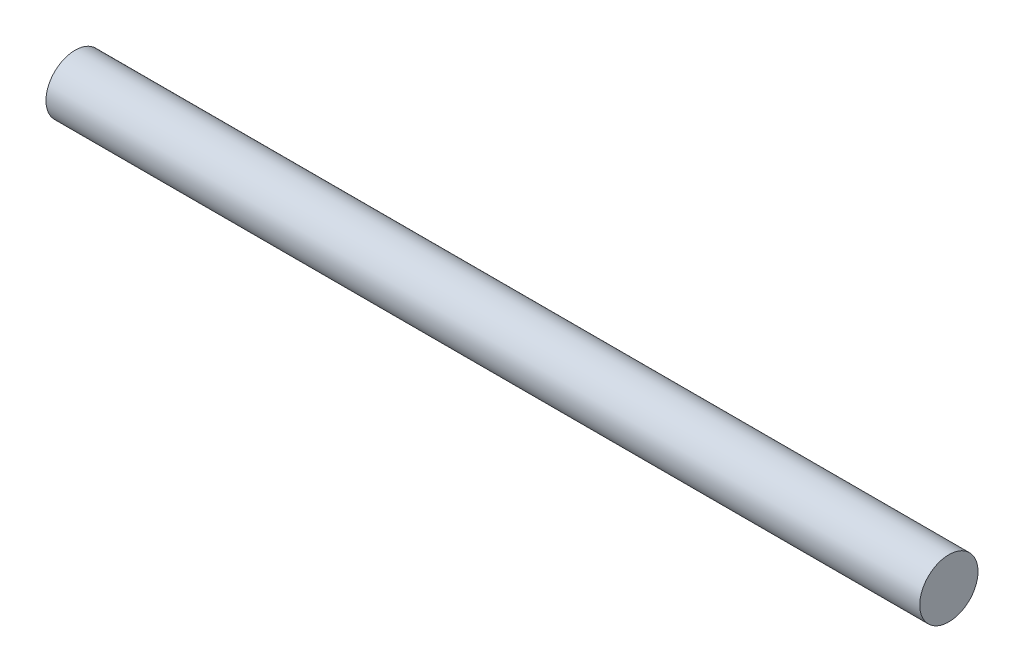
ISO-10303-21;
HEADER;
FILE_DESCRIPTION(('STEP AP214'),'2;1');
FILE_NAME('part.step','',(''),(''),'','','');
FILE_SCHEMA(('AUTOMOTIVE_DESIGN { 1 0 10303 214 1 1 1 1 }'));
ENDSEC;
DATA;
#1=APPLICATION_CONTEXT('core data for automotive mechanical design processes');
#2=APPLICATION_PROTOCOL_DEFINITION('international standard','automotive_design',2000,#1);
#3=PRODUCT_CONTEXT('',#1,'mechanical');
#4=PRODUCT('Part','Part','',(#3));
#5=PRODUCT_RELATED_PRODUCT_CATEGORY('part','',(#4));
#6=PRODUCT_DEFINITION_FORMATION('','',#4);
#7=PRODUCT_DEFINITION_CONTEXT('part definition',#1,'design');
#8=PRODUCT_DEFINITION('design','',#6,#7);
#9=PRODUCT_DEFINITION_SHAPE('','',#8);
#10=(LENGTH_UNIT() NAMED_UNIT(*) SI_UNIT(.MILLI.,.METRE.));
#11=(NAMED_UNIT(*) PLANE_ANGLE_UNIT() SI_UNIT($,.RADIAN.));
#12=(NAMED_UNIT(*) SI_UNIT($,.STERADIAN.) SOLID_ANGLE_UNIT());
#13=UNCERTAINTY_MEASURE_WITH_UNIT(LENGTH_MEASURE(1.E-05),#10,'distance_accuracy_value','');
#14=(GEOMETRIC_REPRESENTATION_CONTEXT(3) GLOBAL_UNCERTAINTY_ASSIGNED_CONTEXT((#13)) GLOBAL_UNIT_ASSIGNED_CONTEXT((#10,
#11,#12)) REPRESENTATION_CONTEXT('',''));
#15=CARTESIAN_POINT('',(0.,0.,0.));
#16=DIRECTION('',(0.,0.,1.));
#17=DIRECTION('',(1.,0.,0.));
#18=AXIS2_PLACEMENT_3D('',#15,#16,#17);
#19=CARTESIAN_POINT('',(120.,0.,0.));
#20=DIRECTION('',(-1.,0.,0.));
#21=DIRECTION('',(0.,0.,1.));
#22=AXIS2_PLACEMENT_3D('',#19,#20,#21);
#23=CYLINDRICAL_SURFACE('',#22,4.);
#24=CARTESIAN_POINT('',(120.,0.,0.));
#25=DIRECTION('',(1.,0.,0.));
#26=DIRECTION('',(0.,0.,-1.));
#27=AXIS2_PLACEMENT_3D('',#24,#25,#26);
#28=CIRCLE('',#27,4.);
#29=CARTESIAN_POINT('',(120.,0.,-4.));
#30=VERTEX_POINT('',#29);
#31=EDGE_CURVE('E10',#30,#30,#28,.T.);
#32=ORIENTED_EDGE('',*,*,#31,.F.);
#33=EDGE_LOOP('',(#32));
#34=FACE_BOUND('',#33,.T.);
#35=CARTESIAN_POINT('',(0.,0.,0.));
#36=DIRECTION('',(1.,0.,0.));
#37=DIRECTION('',(0.,0.,-1.));
#38=AXIS2_PLACEMENT_3D('',#35,#36,#37);
#39=CIRCLE('',#38,4.);
#40=CARTESIAN_POINT('',(0.,0.,-4.));
#41=VERTEX_POINT('',#40);
#42=EDGE_CURVE('E38',#41,#41,#39,.T.);
#43=ORIENTED_EDGE('',*,*,#42,.T.);
#44=EDGE_LOOP('',(#43));
#45=FACE_BOUND('',#44,.T.);
#46=ADVANCED_FACE('F35',(#34,#45),#23,.T.);
#47=CARTESIAN_POINT('',(120.,0.,0.));
#48=DIRECTION('',(1.,0.,0.));
#49=DIRECTION('',(0.,0.,-1.));
#50=AXIS2_PLACEMENT_3D('',#47,#48,#49);
#51=PLANE('',#50);
#52=ORIENTED_EDGE('',*,*,#31,.T.);
#53=EDGE_LOOP('',(#52));
#54=FACE_BOUND('',#53,.T.);
#55=ADVANCED_FACE('F50',(#54),#51,.T.);
#56=CARTESIAN_POINT('',(0.,0.,0.));
#57=DIRECTION('',(1.,0.,0.));
#58=DIRECTION('',(0.,0.,-1.));
#59=AXIS2_PLACEMENT_3D('',#56,#57,#58);
#60=PLANE('',#59);
#61=ORIENTED_EDGE('',*,*,#42,.F.);
#62=EDGE_LOOP('',(#61));
#63=FACE_BOUND('',#62,.T.);
#64=ADVANCED_FACE('F48',(#63),#60,.F.);
#65=CLOSED_SHELL('',(#46,#55,#64));
#66=MANIFOLD_SOLID_BREP('B2',#65);
#67=ADVANCED_BREP_SHAPE_REPRESENTATION('',(#18,#66),#14);
#68=SHAPE_DEFINITION_REPRESENTATION(#9,#67);
ENDSEC;
END-ISO-10303-21;
